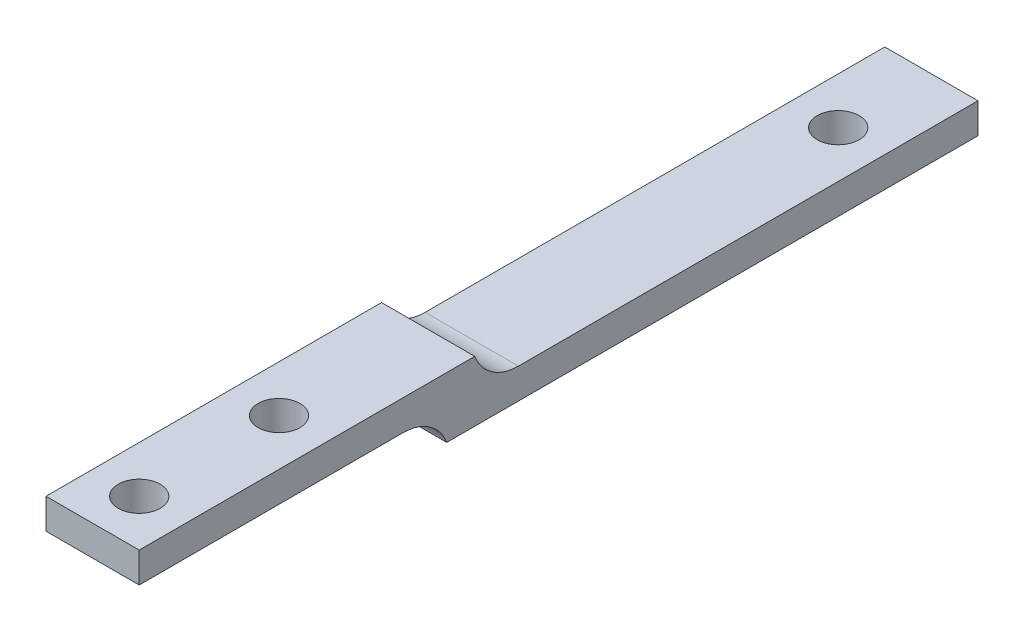
ISO-10303-21;
HEADER;
FILE_DESCRIPTION(('STEP AP214'),'2;1');
FILE_NAME('part.step','',(''),(''),'','','');
FILE_SCHEMA(('AUTOMOTIVE_DESIGN { 1 0 10303 214 1 1 1 1 }'));
ENDSEC;
DATA;
#1=APPLICATION_CONTEXT('core data for automotive mechanical design processes');
#2=APPLICATION_PROTOCOL_DEFINITION('international standard','automotive_design',2000,#1);
#3=PRODUCT_CONTEXT('',#1,'mechanical');
#4=PRODUCT('Part','Part','',(#3));
#5=PRODUCT_RELATED_PRODUCT_CATEGORY('part','',(#4));
#6=PRODUCT_DEFINITION_FORMATION('','',#4);
#7=PRODUCT_DEFINITION_CONTEXT('part definition',#1,'design');
#8=PRODUCT_DEFINITION('design','',#6,#7);
#9=PRODUCT_DEFINITION_SHAPE('','',#8);
#10=(LENGTH_UNIT() NAMED_UNIT(*) SI_UNIT(.MILLI.,.METRE.));
#11=(NAMED_UNIT(*) PLANE_ANGLE_UNIT() SI_UNIT($,.RADIAN.));
#12=(NAMED_UNIT(*) SI_UNIT($,.STERADIAN.) SOLID_ANGLE_UNIT());
#13=UNCERTAINTY_MEASURE_WITH_UNIT(LENGTH_MEASURE(1.E-05),#10,'distance_accuracy_value','');
#14=(GEOMETRIC_REPRESENTATION_CONTEXT(3) GLOBAL_UNCERTAINTY_ASSIGNED_CONTEXT((#13)) GLOBAL_UNIT_ASSIGNED_CONTEXT((#10,
#11,#12)) REPRESENTATION_CONTEXT('',''));
#15=CARTESIAN_POINT('',(0.,0.,0.));
#16=DIRECTION('',(0.,0.,1.));
#17=DIRECTION('',(1.,0.,0.));
#18=AXIS2_PLACEMENT_3D('',#15,#16,#17);
#19=CARTESIAN_POINT('',(0.,6.5,0.));
#20=DIRECTION('',(0.,-1.,0.));
#21=DIRECTION('',(0.,0.,-1.));
#22=AXIS2_PLACEMENT_3D('',#19,#20,#21);
#23=PLANE('',#22);
#24=CARTESIAN_POINT('',(0.,6.5,-5.));
#25=DIRECTION('',(0.,1.,0.));
#26=DIRECTION('',(0.,0.,1.));
#27=AXIS2_PLACEMENT_3D('',#24,#25,#26);
#28=CIRCLE('',#27,2.25);
#29=CARTESIAN_POINT('',(0.,6.5,-7.25));
#30=VERTEX_POINT('',#29);
#31=EDGE_CURVE('E177',#30,#30,#28,.T.);
#32=ORIENTED_EDGE('',*,*,#31,.F.);
#33=EDGE_LOOP('',(#32));
#34=FACE_BOUND('',#33,.T.);
#35=CARTESIAN_POINT('',(0.,6.5,-20.));
#36=DIRECTION('',(0.,1.,0.));
#37=DIRECTION('',(0.,0.,1.));
#38=AXIS2_PLACEMENT_3D('',#35,#36,#37);
#39=CIRCLE('',#38,2.25);
#40=CARTESIAN_POINT('',(0.,6.5,-22.25));
#41=VERTEX_POINT('',#40);
#42=EDGE_CURVE('E180',#41,#41,#39,.T.);
#43=ORIENTED_EDGE('',*,*,#42,.F.);
#44=EDGE_LOOP('',(#43));
#45=FACE_BOUND('',#44,.T.);
#46=DIRECTION('',(-1.,0.,0.));
#47=VECTOR('',#46,1.);
#48=CARTESIAN_POINT('',(5.,6.5,-36.));
#49=LINE('',#48,#47);
#50=CARTESIAN_POINT('',(5.,6.5,-36.));
#51=VERTEX_POINT('',#50);
#52=CARTESIAN_POINT('',(-5.,6.5,-36.));
#53=VERTEX_POINT('',#52);
#54=EDGE_CURVE('E167',#51,#53,#49,.T.);
#55=ORIENTED_EDGE('',*,*,#54,.T.);
#56=DIRECTION('',(0.,0.,1.));
#57=VECTOR('',#56,1.);
#58=CARTESIAN_POINT('',(-5.,6.5,0.));
#59=LINE('',#58,#57);
#60=CARTESIAN_POINT('',(-5.,6.5,0.));
#61=VERTEX_POINT('',#60);
#62=EDGE_CURVE('E132',#53,#61,#59,.T.);
#63=ORIENTED_EDGE('',*,*,#62,.T.);
#64=DIRECTION('',(1.,0.,0.));
#65=VECTOR('',#64,1.);
#66=CARTESIAN_POINT('',(5.,6.5,0.));
#67=LINE('',#66,#65);
#68=CARTESIAN_POINT('',(5.,6.5,0.));
#69=VERTEX_POINT('',#68);
#70=EDGE_CURVE('E120',#61,#69,#67,.T.);
#71=ORIENTED_EDGE('',*,*,#70,.T.);
#72=DIRECTION('',(0.,0.,-1.));
#73=VECTOR('',#72,1.);
#74=CARTESIAN_POINT('',(5.,6.5,-90.));
#75=LINE('',#74,#73);
#76=EDGE_CURVE('E124',#69,#51,#75,.T.);
#77=ORIENTED_EDGE('',*,*,#76,.T.);
#78=EDGE_LOOP('',(#55,#63,#71,#77));
#79=FACE_BOUND('',#78,.T.);
#80=ADVANCED_FACE('F33',(#34,#45,#79),#23,.F.);
#81=CARTESIAN_POINT('',(0.,0.,0.));
#82=DIRECTION('',(0.,-1.,0.));
#83=DIRECTION('',(0.,0.,-1.));
#84=AXIS2_PLACEMENT_3D('',#81,#82,#83);
#85=PLANE('',#84);
#86=CARTESIAN_POINT('',(0.,0.,-80.));
#87=DIRECTION('',(0.,1.,0.));
#88=DIRECTION('',(0.,0.,1.));
#89=AXIS2_PLACEMENT_3D('',#86,#87,#88);
#90=CIRCLE('',#89,2.25);
#91=CARTESIAN_POINT('',(0.,0.,-82.25));
#92=VERTEX_POINT('',#91);
#93=EDGE_CURVE('E174',#92,#92,#90,.T.);
#94=ORIENTED_EDGE('',*,*,#93,.T.);
#95=EDGE_LOOP('',(#94));
#96=FACE_BOUND('',#95,.T.);
#97=DIRECTION('',(0.,0.,-1.));
#98=VECTOR('',#97,1.);
#99=CARTESIAN_POINT('',(5.,0.,-90.));
#100=LINE('',#99,#98);
#101=CARTESIAN_POINT('',(5.,0.,-33.));
#102=VERTEX_POINT('',#101);
#103=CARTESIAN_POINT('',(5.,0.,-90.));
#104=VERTEX_POINT('',#103);
#105=EDGE_CURVE('E112',#102,#104,#100,.T.);
#106=ORIENTED_EDGE('',*,*,#105,.F.);
#107=DIRECTION('',(-1.,0.,0.));
#108=VECTOR('',#107,1.);
#109=CARTESIAN_POINT('',(5.,0.,-33.));
#110=LINE('',#109,#108);
#111=CARTESIAN_POINT('',(-5.,0.,-33.));
#112=VERTEX_POINT('',#111);
#113=EDGE_CURVE('E100',#102,#112,#110,.T.);
#114=ORIENTED_EDGE('',*,*,#113,.T.);
#115=DIRECTION('',(0.,0.,1.));
#116=VECTOR('',#115,1.);
#117=CARTESIAN_POINT('',(-5.,0.,0.));
#118=LINE('',#117,#116);
#119=CARTESIAN_POINT('',(-5.,0.,-90.));
#120=VERTEX_POINT('',#119);
#121=EDGE_CURVE('E111',#120,#112,#118,.T.);
#122=ORIENTED_EDGE('',*,*,#121,.F.);
#123=DIRECTION('',(-1.,0.,0.));
#124=VECTOR('',#123,1.);
#125=CARTESIAN_POINT('',(-5.,0.,-90.));
#126=LINE('',#125,#124);
#127=EDGE_CURVE('E121',#104,#120,#126,.T.);
#128=ORIENTED_EDGE('',*,*,#127,.F.);
#129=EDGE_LOOP('',(#106,#114,#122,#128));
#130=FACE_BOUND('',#129,.T.);
#131=ADVANCED_FACE('F109',(#96,#130),#85,.T.);
#132=CARTESIAN_POINT('',(5.,6.5,-90.));
#133=DIRECTION('',(-1.,0.,0.));
#134=DIRECTION('',(0.,0.,1.));
#135=AXIS2_PLACEMENT_3D('',#132,#133,#134);
#136=PLANE('',#135);
#137=DIRECTION('',(0.,0.,1.));
#138=VECTOR('',#137,1.);
#139=CARTESIAN_POINT('',(5.,3.25,0.));
#140=LINE('',#139,#138);
#141=CARTESIAN_POINT('',(5.,3.25,-28.3162515012012));
#142=VERTEX_POINT('',#141);
#143=CARTESIAN_POINT('',(5.,3.25,0.));
#144=VERTEX_POINT('',#143);
#145=EDGE_CURVE('E152',#142,#144,#140,.T.);
#146=ORIENTED_EDGE('',*,*,#145,.F.);
#147=CARTESIAN_POINT('',(5.,-1.75,-28.3162515012012));
#148=DIRECTION('',(-1.,0.,0.));
#149=DIRECTION('',(0.,0.,1.));
#150=AXIS2_PLACEMENT_3D('',#147,#148,#149);
#151=CIRCLE('',#150,5.);
#152=EDGE_CURVE('E104',#142,#102,#151,.T.);
#153=ORIENTED_EDGE('',*,*,#152,.T.);
#154=ORIENTED_EDGE('',*,*,#105,.T.);
#155=DIRECTION('',(0.,-1.,0.));
#156=VECTOR('',#155,1.);
#157=CARTESIAN_POINT('',(5.,6.5,-90.));
#158=LINE('',#157,#156);
#159=CARTESIAN_POINT('',(5.,3.25,-90.));
#160=VERTEX_POINT('',#159);
#161=EDGE_CURVE('E134',#160,#104,#158,.T.);
#162=ORIENTED_EDGE('',*,*,#161,.F.);
#163=DIRECTION('',(0.,0.,-1.));
#164=VECTOR('',#163,1.);
#165=CARTESIAN_POINT('',(5.,3.25,-90.));
#166=LINE('',#165,#164);
#167=CARTESIAN_POINT('',(5.,3.25,-40.6837484987988));
#168=VERTEX_POINT('',#167);
#169=EDGE_CURVE('E165',#168,#160,#166,.T.);
#170=ORIENTED_EDGE('',*,*,#169,.F.);
#171=CARTESIAN_POINT('',(5.,8.25,-40.6837484987988));
#172=DIRECTION('',(-1.,0.,0.));
#173=DIRECTION('',(0.,0.,1.));
#174=AXIS2_PLACEMENT_3D('',#171,#172,#173);
#175=CIRCLE('',#174,5.);
#176=EDGE_CURVE('E11',#168,#51,#175,.T.);
#177=ORIENTED_EDGE('',*,*,#176,.T.);
#178=ORIENTED_EDGE('',*,*,#76,.F.);
#179=DIRECTION('',(0.,-1.,0.));
#180=VECTOR('',#179,1.);
#181=CARTESIAN_POINT('',(5.,6.5,0.));
#182=LINE('',#181,#180);
#183=EDGE_CURVE('E137',#69,#144,#182,.T.);
#184=ORIENTED_EDGE('',*,*,#183,.T.);
#185=EDGE_LOOP('',(#146,#153,#154,#162,#170,#177,#178,#184));
#186=FACE_BOUND('',#185,.T.);
#187=ADVANCED_FACE('F150',(#186),#136,.F.);
#188=CARTESIAN_POINT('',(-5.,6.5,-90.));
#189=DIRECTION('',(0.,0.,1.));
#190=DIRECTION('',(1.,0.,0.));
#191=AXIS2_PLACEMENT_3D('',#188,#189,#190);
#192=PLANE('',#191);
#193=DIRECTION('',(-1.,0.,0.));
#194=VECTOR('',#193,1.);
#195=CARTESIAN_POINT('',(5.,3.25,-90.));
#196=LINE('',#195,#194);
#197=CARTESIAN_POINT('',(-5.,3.25,-90.));
#198=VERTEX_POINT('',#197);
#199=EDGE_CURVE('E160',#160,#198,#196,.T.);
#200=ORIENTED_EDGE('',*,*,#199,.F.);
#201=ORIENTED_EDGE('',*,*,#161,.T.);
#202=ORIENTED_EDGE('',*,*,#127,.T.);
#203=DIRECTION('',(0.,-1.,0.));
#204=VECTOR('',#203,1.);
#205=CARTESIAN_POINT('',(-5.,6.5,-90.));
#206=LINE('',#205,#204);
#207=EDGE_CURVE('E118',#198,#120,#206,.T.);
#208=ORIENTED_EDGE('',*,*,#207,.F.);
#209=EDGE_LOOP('',(#200,#201,#202,#208));
#210=FACE_BOUND('',#209,.T.);
#211=ADVANCED_FACE('F223',(#210),#192,.F.);
#212=CARTESIAN_POINT('',(-5.,6.5,0.));
#213=DIRECTION('',(1.,0.,0.));
#214=DIRECTION('',(0.,0.,-1.));
#215=AXIS2_PLACEMENT_3D('',#212,#213,#214);
#216=PLANE('',#215);
#217=ORIENTED_EDGE('',*,*,#121,.T.);
#218=CARTESIAN_POINT('',(-5.,-1.75,-28.3162515012012));
#219=DIRECTION('',(1.,0.,0.));
#220=DIRECTION('',(0.,0.,-1.));
#221=AXIS2_PLACEMENT_3D('',#218,#219,#220);
#222=CIRCLE('',#221,5.);
#223=CARTESIAN_POINT('',(-5.,3.25,-28.3162515012012));
#224=VERTEX_POINT('',#223);
#225=EDGE_CURVE('E96',#112,#224,#222,.T.);
#226=ORIENTED_EDGE('',*,*,#225,.T.);
#227=DIRECTION('',(0.,0.,1.));
#228=VECTOR('',#227,1.);
#229=CARTESIAN_POINT('',(-5.,3.25,0.));
#230=LINE('',#229,#228);
#231=CARTESIAN_POINT('',(-5.,3.25,0.));
#232=VERTEX_POINT('',#231);
#233=EDGE_CURVE('E157',#224,#232,#230,.T.);
#234=ORIENTED_EDGE('',*,*,#233,.T.);
#235=DIRECTION('',(0.,-1.,0.));
#236=VECTOR('',#235,1.);
#237=CARTESIAN_POINT('',(-5.,6.5,0.));
#238=LINE('',#237,#236);
#239=EDGE_CURVE('E129',#61,#232,#238,.T.);
#240=ORIENTED_EDGE('',*,*,#239,.F.);
#241=ORIENTED_EDGE('',*,*,#62,.F.);
#242=CARTESIAN_POINT('',(-5.,8.25,-40.6837484987988));
#243=DIRECTION('',(1.,0.,0.));
#244=DIRECTION('',(0.,0.,-1.));
#245=AXIS2_PLACEMENT_3D('',#242,#243,#244);
#246=CIRCLE('',#245,5.);
#247=CARTESIAN_POINT('',(-5.,3.25,-40.6837484987988));
#248=VERTEX_POINT('',#247);
#249=EDGE_CURVE('E41',#53,#248,#246,.T.);
#250=ORIENTED_EDGE('',*,*,#249,.T.);
#251=DIRECTION('',(0.,0.,-1.));
#252=VECTOR('',#251,1.);
#253=CARTESIAN_POINT('',(-5.,3.25,-90.));
#254=LINE('',#253,#252);
#255=EDGE_CURVE('E163',#248,#198,#254,.T.);
#256=ORIENTED_EDGE('',*,*,#255,.T.);
#257=ORIENTED_EDGE('',*,*,#207,.T.);
#258=EDGE_LOOP('',(#217,#226,#234,#240,#241,#250,#256,#257));
#259=FACE_BOUND('',#258,.T.);
#260=ADVANCED_FACE('F116',(#259),#216,.F.);
#261=CARTESIAN_POINT('',(0.,6.5,0.));
#262=DIRECTION('',(0.,0.,-1.));
#263=DIRECTION('',(-1.,0.,0.));
#264=AXIS2_PLACEMENT_3D('',#261,#262,#263);
#265=PLANE('',#264);
#266=DIRECTION('',(-1.,0.,0.));
#267=VECTOR('',#266,1.);
#268=CARTESIAN_POINT('',(5.,3.25,0.));
#269=LINE('',#268,#267);
#270=EDGE_CURVE('E114',#144,#232,#269,.T.);
#271=ORIENTED_EDGE('',*,*,#270,.F.);
#272=ORIENTED_EDGE('',*,*,#183,.F.);
#273=ORIENTED_EDGE('',*,*,#70,.F.);
#274=ORIENTED_EDGE('',*,*,#239,.T.);
#275=EDGE_LOOP('',(#271,#272,#273,#274));
#276=FACE_BOUND('',#275,.T.);
#277=ADVANCED_FACE('F190',(#276),#265,.F.);
#278=CARTESIAN_POINT('',(0.,6.5,-20.));
#279=DIRECTION('',(0.,-1.,0.));
#280=DIRECTION('',(0.,0.,-1.));
#281=AXIS2_PLACEMENT_3D('',#278,#279,#280);
#282=CYLINDRICAL_SURFACE('',#281,2.25);
#283=CARTESIAN_POINT('',(0.,3.25,-20.));
#284=DIRECTION('',(0.,-1.,0.));
#285=DIRECTION('',(0.,0.,-1.));
#286=AXIS2_PLACEMENT_3D('',#283,#284,#285);
#287=CIRCLE('',#286,2.25);
#288=CARTESIAN_POINT('',(0.,3.25,-22.25));
#289=VERTEX_POINT('',#288);
#290=EDGE_CURVE('E145',#289,#289,#287,.T.);
#291=CARTESIAN_POINT('',(0.,6.5,-22.25));
#292=CARTESIAN_POINT('',(0.,6.46614583333333,-22.25));
#293=CARTESIAN_POINT('',(0.,6.43229166666667,-22.25));
#294=CARTESIAN_POINT('',(0.,6.36458333333333,-22.25));
#295=CARTESIAN_POINT('',(0.,6.33072916666667,-22.25));
#296=CARTESIAN_POINT('',(0.,6.26302083333333,-22.25));
#297=CARTESIAN_POINT('',(0.,6.22916666666667,-22.25));
#298=CARTESIAN_POINT('',(0.,6.16145833333333,-22.25));
#299=CARTESIAN_POINT('',(0.,6.12760416666667,-22.25));
#300=CARTESIAN_POINT('',(0.,6.05989583333333,-22.25));
#301=CARTESIAN_POINT('',(0.,6.02604166666667,-22.25));
#302=CARTESIAN_POINT('',(0.,5.95833333333333,-22.25));
#303=CARTESIAN_POINT('',(0.,5.92447916666667,-22.25));
#304=CARTESIAN_POINT('',(0.,5.85677083333333,-22.25));
#305=CARTESIAN_POINT('',(0.,5.82291666666667,-22.25));
#306=CARTESIAN_POINT('',(0.,5.75520833333333,-22.25));
#307=CARTESIAN_POINT('',(0.,5.72135416666667,-22.25));
#308=CARTESIAN_POINT('',(0.,5.65364583333333,-22.25));
#309=CARTESIAN_POINT('',(0.,5.61979166666667,-22.25));
#310=CARTESIAN_POINT('',(0.,5.55208333333333,-22.25));
#311=CARTESIAN_POINT('',(0.,5.51822916666667,-22.25));
#312=CARTESIAN_POINT('',(0.,5.45052083333333,-22.25));
#313=CARTESIAN_POINT('',(0.,5.41666666666667,-22.25));
#314=CARTESIAN_POINT('',(0.,5.34895833333333,-22.25));
#315=CARTESIAN_POINT('',(0.,5.31510416666667,-22.25));
#316=CARTESIAN_POINT('',(0.,5.24739583333333,-22.25));
#317=CARTESIAN_POINT('',(0.,5.21354166666667,-22.25));
#318=CARTESIAN_POINT('',(0.,5.14583333333333,-22.25));
#319=CARTESIAN_POINT('',(0.,5.11197916666667,-22.25));
#320=CARTESIAN_POINT('',(0.,5.04427083333333,-22.25));
#321=CARTESIAN_POINT('',(0.,5.01041666666667,-22.25));
#322=CARTESIAN_POINT('',(0.,4.94270833333333,-22.25));
#323=CARTESIAN_POINT('',(0.,4.90885416666667,-22.25));
#324=CARTESIAN_POINT('',(0.,4.84114583333333,-22.25));
#325=CARTESIAN_POINT('',(0.,4.80729166666667,-22.25));
#326=CARTESIAN_POINT('',(0.,4.73958333333333,-22.25));
#327=CARTESIAN_POINT('',(0.,4.70572916666667,-22.25));
#328=CARTESIAN_POINT('',(0.,4.63802083333333,-22.25));
#329=CARTESIAN_POINT('',(0.,4.60416666666667,-22.25));
#330=CARTESIAN_POINT('',(0.,4.53645833333333,-22.25));
#331=CARTESIAN_POINT('',(0.,4.50260416666667,-22.25));
#332=CARTESIAN_POINT('',(0.,4.43489583333333,-22.25));
#333=CARTESIAN_POINT('',(0.,4.40104166666667,-22.25));
#334=CARTESIAN_POINT('',(0.,4.33333333333333,-22.25));
#335=CARTESIAN_POINT('',(0.,4.29947916666667,-22.25));
#336=CARTESIAN_POINT('',(0.,4.23177083333333,-22.25));
#337=CARTESIAN_POINT('',(0.,4.19791666666667,-22.25));
#338=CARTESIAN_POINT('',(0.,4.13020833333333,-22.25));
#339=CARTESIAN_POINT('',(0.,4.09635416666667,-22.25));
#340=CARTESIAN_POINT('',(0.,4.02864583333333,-22.25));
#341=CARTESIAN_POINT('',(0.,3.99479166666667,-22.25));
#342=CARTESIAN_POINT('',(0.,3.92708333333333,-22.25));
#343=CARTESIAN_POINT('',(0.,3.89322916666667,-22.25));
#344=CARTESIAN_POINT('',(0.,3.82552083333333,-22.25));
#345=CARTESIAN_POINT('',(0.,3.79166666666667,-22.25));
#346=CARTESIAN_POINT('',(0.,3.72395833333333,-22.25));
#347=CARTESIAN_POINT('',(0.,3.69010416666667,-22.25));
#348=CARTESIAN_POINT('',(0.,3.62239583333333,-22.25));
#349=CARTESIAN_POINT('',(0.,3.58854166666667,-22.25));
#350=CARTESIAN_POINT('',(0.,3.52083333333333,-22.25));
#351=CARTESIAN_POINT('',(0.,3.48697916666667,-22.25));
#352=CARTESIAN_POINT('',(0.,3.41927083333333,-22.25));
#353=CARTESIAN_POINT('',(0.,3.38541666666667,-22.25));
#354=CARTESIAN_POINT('',(0.,3.31770833333333,-22.25));
#355=CARTESIAN_POINT('',(0.,3.28385416666667,-22.25));
#356=CARTESIAN_POINT('',(0.,3.25,-22.25));
#357=B_SPLINE_CURVE_WITH_KNOTS('',3,(#291,#292,#293,#294,#295,#296,#297,#298,#299,#300,#301,
#302,#303,#304,#305,#306,#307,#308,#309,#310,#311,#312,#313,#314,#315,#316,#317,#318,#319,#320,
#321,#322,#323,#324,#325,#326,#327,#328,#329,#330,#331,#332,#333,#334,#335,#336,#337,#338,#339,
#340,#341,#342,#343,#344,#345,#346,#347,#348,#349,#350,#351,#352,#353,#354,#355,#356),
.UNSPECIFIED.,.F.,.F.,(4,2,2,2,2,2,2,2,2,2,2,2,2,2,2,2,2,2,2,2,2,2,2,2,2,2,2,2,2,2,2,2,4),(0.,
0.101562499999999,0.203124999999999,0.304687499999999,0.40625,0.5078125,0.609375,0.7109375,
0.812499999999999,0.914062499999999,1.015625,1.1171875,1.21875,1.3203125,1.421875,1.5234375,
1.625,1.7265625,1.828125,1.9296875,2.03125,2.1328125,2.234375,2.3359375,2.4375,2.5390625,
2.640625,2.7421875,2.84375,2.9453125,3.046875,3.1484375,3.25),.UNSPECIFIED.);
#358=EDGE_CURVE('BSEAM216',#41,#289,#357,.T.);
#359=ORIENTED_EDGE('',*,*,#42,.T.);
#360=ORIENTED_EDGE('',*,*,#290,.T.);
#361=ORIENTED_EDGE('',*,*,#358,.T.);
#362=ORIENTED_EDGE('',*,*,#358,.F.);
#363=EDGE_LOOP('',(#359,#361,#360,#362));
#364=FACE_BOUND('',#363,.T.);
#365=ADVANCED_FACE('F216',(#364),#282,.F.);
#366=CARTESIAN_POINT('',(0.,6.5,-5.));
#367=DIRECTION('',(0.,-1.,0.));
#368=DIRECTION('',(0.,0.,-1.));
#369=AXIS2_PLACEMENT_3D('',#366,#367,#368);
#370=CYLINDRICAL_SURFACE('',#369,2.25);
#371=CARTESIAN_POINT('',(0.,3.25,-5.));
#372=DIRECTION('',(0.,-1.,0.));
#373=DIRECTION('',(0.,0.,-1.));
#374=AXIS2_PLACEMENT_3D('',#371,#372,#373);
#375=CIRCLE('',#374,2.25);
#376=CARTESIAN_POINT('',(0.,3.25,-7.25));
#377=VERTEX_POINT('',#376);
#378=EDGE_CURVE('E142',#377,#377,#375,.T.);
#379=CARTESIAN_POINT('',(0.,6.5,-7.25));
#380=CARTESIAN_POINT('',(0.,6.46614583333333,-7.25));
#381=CARTESIAN_POINT('',(0.,6.43229166666667,-7.25));
#382=CARTESIAN_POINT('',(0.,6.36458333333333,-7.25));
#383=CARTESIAN_POINT('',(0.,6.33072916666667,-7.25));
#384=CARTESIAN_POINT('',(0.,6.26302083333333,-7.25));
#385=CARTESIAN_POINT('',(0.,6.22916666666667,-7.25));
#386=CARTESIAN_POINT('',(0.,6.16145833333333,-7.25));
#387=CARTESIAN_POINT('',(0.,6.12760416666667,-7.25));
#388=CARTESIAN_POINT('',(0.,6.05989583333333,-7.25));
#389=CARTESIAN_POINT('',(0.,6.02604166666667,-7.25));
#390=CARTESIAN_POINT('',(0.,5.95833333333333,-7.25));
#391=CARTESIAN_POINT('',(0.,5.92447916666667,-7.25));
#392=CARTESIAN_POINT('',(0.,5.85677083333333,-7.25));
#393=CARTESIAN_POINT('',(0.,5.82291666666667,-7.25));
#394=CARTESIAN_POINT('',(0.,5.75520833333333,-7.25));
#395=CARTESIAN_POINT('',(0.,5.72135416666667,-7.25));
#396=CARTESIAN_POINT('',(0.,5.65364583333333,-7.25));
#397=CARTESIAN_POINT('',(0.,5.61979166666667,-7.25));
#398=CARTESIAN_POINT('',(0.,5.55208333333333,-7.25));
#399=CARTESIAN_POINT('',(0.,5.51822916666667,-7.25));
#400=CARTESIAN_POINT('',(0.,5.45052083333333,-7.25));
#401=CARTESIAN_POINT('',(0.,5.41666666666667,-7.25));
#402=CARTESIAN_POINT('',(0.,5.34895833333333,-7.25));
#403=CARTESIAN_POINT('',(0.,5.31510416666667,-7.25));
#404=CARTESIAN_POINT('',(0.,5.24739583333333,-7.25));
#405=CARTESIAN_POINT('',(0.,5.21354166666667,-7.25));
#406=CARTESIAN_POINT('',(0.,5.14583333333333,-7.25));
#407=CARTESIAN_POINT('',(0.,5.11197916666667,-7.25));
#408=CARTESIAN_POINT('',(0.,5.04427083333333,-7.25));
#409=CARTESIAN_POINT('',(0.,5.01041666666667,-7.25));
#410=CARTESIAN_POINT('',(0.,4.94270833333333,-7.25));
#411=CARTESIAN_POINT('',(0.,4.90885416666667,-7.25));
#412=CARTESIAN_POINT('',(0.,4.84114583333333,-7.25));
#413=CARTESIAN_POINT('',(0.,4.80729166666667,-7.25));
#414=CARTESIAN_POINT('',(0.,4.73958333333333,-7.25));
#415=CARTESIAN_POINT('',(0.,4.70572916666667,-7.25));
#416=CARTESIAN_POINT('',(0.,4.63802083333333,-7.25));
#417=CARTESIAN_POINT('',(0.,4.60416666666667,-7.25));
#418=CARTESIAN_POINT('',(0.,4.53645833333333,-7.25));
#419=CARTESIAN_POINT('',(0.,4.50260416666667,-7.25));
#420=CARTESIAN_POINT('',(0.,4.43489583333333,-7.25));
#421=CARTESIAN_POINT('',(0.,4.40104166666667,-7.25));
#422=CARTESIAN_POINT('',(0.,4.33333333333333,-7.25));
#423=CARTESIAN_POINT('',(0.,4.29947916666667,-7.25));
#424=CARTESIAN_POINT('',(0.,4.23177083333333,-7.25));
#425=CARTESIAN_POINT('',(0.,4.19791666666667,-7.25));
#426=CARTESIAN_POINT('',(0.,4.13020833333333,-7.25));
#427=CARTESIAN_POINT('',(0.,4.09635416666667,-7.25));
#428=CARTESIAN_POINT('',(0.,4.02864583333333,-7.25));
#429=CARTESIAN_POINT('',(0.,3.99479166666667,-7.25));
#430=CARTESIAN_POINT('',(0.,3.92708333333333,-7.25));
#431=CARTESIAN_POINT('',(0.,3.89322916666667,-7.25));
#432=CARTESIAN_POINT('',(0.,3.82552083333333,-7.25));
#433=CARTESIAN_POINT('',(0.,3.79166666666667,-7.25));
#434=CARTESIAN_POINT('',(0.,3.72395833333333,-7.25));
#435=CARTESIAN_POINT('',(0.,3.69010416666667,-7.25));
#436=CARTESIAN_POINT('',(0.,3.62239583333333,-7.25));
#437=CARTESIAN_POINT('',(0.,3.58854166666667,-7.25));
#438=CARTESIAN_POINT('',(0.,3.52083333333333,-7.25));
#439=CARTESIAN_POINT('',(0.,3.48697916666667,-7.25));
#440=CARTESIAN_POINT('',(0.,3.41927083333333,-7.25));
#441=CARTESIAN_POINT('',(0.,3.38541666666667,-7.25));
#442=CARTESIAN_POINT('',(0.,3.31770833333333,-7.25));
#443=CARTESIAN_POINT('',(0.,3.28385416666667,-7.25));
#444=CARTESIAN_POINT('',(0.,3.25,-7.25));
#445=B_SPLINE_CURVE_WITH_KNOTS('',3,(#379,#380,#381,#382,#383,#384,#385,#386,#387,#388,#389,
#390,#391,#392,#393,#394,#395,#396,#397,#398,#399,#400,#401,#402,#403,#404,#405,#406,#407,#408,
#409,#410,#411,#412,#413,#414,#415,#416,#417,#418,#419,#420,#421,#422,#423,#424,#425,#426,#427,
#428,#429,#430,#431,#432,#433,#434,#435,#436,#437,#438,#439,#440,#441,#442,#443,#444),
.UNSPECIFIED.,.F.,.F.,(4,2,2,2,2,2,2,2,2,2,2,2,2,2,2,2,2,2,2,2,2,2,2,2,2,2,2,2,2,2,2,2,4),(0.,
0.1015625,0.203125,0.3046875,0.40625,0.5078125,0.609375,0.7109375,0.8125,0.9140625,1.015625,
1.1171875,1.21875,1.3203125,1.421875,1.5234375,1.625,1.7265625,1.828125,1.9296875,2.03125,
2.1328125,2.234375,2.3359375,2.4375,2.5390625,2.640625,2.7421875,2.84375,2.9453125,3.046875,
3.1484375,3.25),.UNSPECIFIED.);
#446=EDGE_CURVE('BSEAM251',#30,#377,#445,.T.);
#447=ORIENTED_EDGE('',*,*,#31,.T.);
#448=ORIENTED_EDGE('',*,*,#378,.T.);
#449=ORIENTED_EDGE('',*,*,#446,.T.);
#450=ORIENTED_EDGE('',*,*,#446,.F.);
#451=EDGE_LOOP('',(#447,#449,#448,#450));
#452=FACE_BOUND('',#451,.T.);
#453=ADVANCED_FACE('F251',(#452),#370,.F.);
#454=CARTESIAN_POINT('',(0.,6.5,-80.));
#455=DIRECTION('',(0.,-1.,0.));
#456=DIRECTION('',(0.,0.,-1.));
#457=AXIS2_PLACEMENT_3D('',#454,#455,#456);
#458=CYLINDRICAL_SURFACE('',#457,2.25);
#459=CARTESIAN_POINT('',(0.,3.25,-80.));
#460=DIRECTION('',(0.,1.,0.));
#461=DIRECTION('',(0.,0.,1.));
#462=AXIS2_PLACEMENT_3D('',#459,#460,#461);
#463=CIRCLE('',#462,2.25);
#464=CARTESIAN_POINT('',(0.,3.25,-82.25));
#465=VERTEX_POINT('',#464);
#466=EDGE_CURVE('E113',#465,#465,#463,.T.);
#467=CARTESIAN_POINT('',(0.,0.,-82.25));
#468=CARTESIAN_POINT('',(0.,0.0338541666666667,-82.25));
#469=CARTESIAN_POINT('',(0.,0.0677083333333334,-82.25));
#470=CARTESIAN_POINT('',(0.,0.135416666666667,-82.25));
#471=CARTESIAN_POINT('',(0.,0.169270833333334,-82.25));
#472=CARTESIAN_POINT('',(0.,0.236979166666667,-82.25));
#473=CARTESIAN_POINT('',(0.,0.270833333333333,-82.25));
#474=CARTESIAN_POINT('',(0.,0.338541666666666,-82.25));
#475=CARTESIAN_POINT('',(0.,0.372395833333333,-82.25));
#476=CARTESIAN_POINT('',(0.,0.440104166666666,-82.25));
#477=CARTESIAN_POINT('',(0.,0.473958333333333,-82.25));
#478=CARTESIAN_POINT('',(0.,0.541666666666666,-82.25));
#479=CARTESIAN_POINT('',(0.,0.575520833333333,-82.25));
#480=CARTESIAN_POINT('',(0.,0.643229166666666,-82.25));
#481=CARTESIAN_POINT('',(0.,0.677083333333333,-82.25));
#482=CARTESIAN_POINT('',(0.,0.744791666666667,-82.25));
#483=CARTESIAN_POINT('',(0.,0.778645833333333,-82.25));
#484=CARTESIAN_POINT('',(0.,0.846354166666667,-82.25));
#485=CARTESIAN_POINT('',(0.,0.880208333333333,-82.25));
#486=CARTESIAN_POINT('',(0.,0.947916666666666,-82.25));
#487=CARTESIAN_POINT('',(0.,0.981770833333333,-82.25));
#488=CARTESIAN_POINT('',(0.,1.04947916666667,-82.25));
#489=CARTESIAN_POINT('',(0.,1.08333333333333,-82.25));
#490=CARTESIAN_POINT('',(0.,1.15104166666667,-82.25));
#491=CARTESIAN_POINT('',(0.,1.18489583333333,-82.25));
#492=CARTESIAN_POINT('',(0.,1.25260416666667,-82.25));
#493=CARTESIAN_POINT('',(0.,1.28645833333333,-82.25));
#494=CARTESIAN_POINT('',(0.,1.35416666666667,-82.25));
#495=CARTESIAN_POINT('',(0.,1.38802083333333,-82.25));
#496=CARTESIAN_POINT('',(0.,1.45572916666667,-82.25));
#497=CARTESIAN_POINT('',(0.,1.48958333333333,-82.25));
#498=CARTESIAN_POINT('',(0.,1.55729166666667,-82.25));
#499=CARTESIAN_POINT('',(0.,1.59114583333333,-82.25));
#500=CARTESIAN_POINT('',(0.,1.65885416666667,-82.25));
#501=CARTESIAN_POINT('',(0.,1.69270833333333,-82.25));
#502=CARTESIAN_POINT('',(0.,1.76041666666667,-82.25));
#503=CARTESIAN_POINT('',(0.,1.79427083333333,-82.25));
#504=CARTESIAN_POINT('',(0.,1.86197916666667,-82.25));
#505=CARTESIAN_POINT('',(0.,1.89583333333333,-82.25));
#506=CARTESIAN_POINT('',(0.,1.96354166666667,-82.25));
#507=CARTESIAN_POINT('',(0.,1.99739583333333,-82.25));
#508=CARTESIAN_POINT('',(0.,2.06510416666667,-82.25));
#509=CARTESIAN_POINT('',(0.,2.09895833333333,-82.25));
#510=CARTESIAN_POINT('',(0.,2.16666666666667,-82.25));
#511=CARTESIAN_POINT('',(0.,2.20052083333333,-82.25));
#512=CARTESIAN_POINT('',(0.,2.26822916666667,-82.25));
#513=CARTESIAN_POINT('',(0.,2.30208333333333,-82.25));
#514=CARTESIAN_POINT('',(0.,2.36979166666667,-82.25));
#515=CARTESIAN_POINT('',(0.,2.40364583333333,-82.25));
#516=CARTESIAN_POINT('',(0.,2.47135416666667,-82.25));
#517=CARTESIAN_POINT('',(0.,2.50520833333333,-82.25));
#518=CARTESIAN_POINT('',(0.,2.57291666666667,-82.25));
#519=CARTESIAN_POINT('',(0.,2.60677083333333,-82.25));
#520=CARTESIAN_POINT('',(0.,2.67447916666667,-82.25));
#521=CARTESIAN_POINT('',(0.,2.70833333333333,-82.25));
#522=CARTESIAN_POINT('',(0.,2.77604166666666,-82.25));
#523=CARTESIAN_POINT('',(0.,2.80989583333333,-82.25));
#524=CARTESIAN_POINT('',(0.,2.87760416666667,-82.25));
#525=CARTESIAN_POINT('',(0.,2.91145833333333,-82.25));
#526=CARTESIAN_POINT('',(0.,2.97916666666667,-82.25));
#527=CARTESIAN_POINT('',(0.,3.01302083333333,-82.25));
#528=CARTESIAN_POINT('',(0.,3.08072916666666,-82.25));
#529=CARTESIAN_POINT('',(0.,3.11458333333333,-82.25));
#530=CARTESIAN_POINT('',(0.,3.18229166666666,-82.25));
#531=CARTESIAN_POINT('',(0.,3.21614583333333,-82.25));
#532=CARTESIAN_POINT('',(0.,3.25,-82.25));
#533=B_SPLINE_CURVE_WITH_KNOTS('',3,(#467,#468,#469,#470,#471,#472,#473,#474,#475,#476,#477,
#478,#479,#480,#481,#482,#483,#484,#485,#486,#487,#488,#489,#490,#491,#492,#493,#494,#495,#496,
#497,#498,#499,#500,#501,#502,#503,#504,#505,#506,#507,#508,#509,#510,#511,#512,#513,#514,#515,
#516,#517,#518,#519,#520,#521,#522,#523,#524,#525,#526,#527,#528,#529,#530,#531,#532),
.UNSPECIFIED.,.F.,.F.,(4,2,2,2,2,2,2,2,2,2,2,2,2,2,2,2,2,2,2,2,2,2,2,2,2,2,2,2,2,2,2,2,4),(0.,
0.1015625,0.203125,0.304687499999999,0.40625,0.5078125,0.609375,0.7109375,0.8125,0.9140625,
1.015625,1.1171875,1.21875,1.3203125,1.421875,1.5234375,1.625,1.7265625,1.828125,1.9296875,
2.03125,2.1328125,2.234375,2.3359375,2.4375,2.5390625,2.640625,2.7421875,2.84375,2.9453125,
3.046875,3.1484375,3.25),.UNSPECIFIED.);
#534=EDGE_CURVE('BSEAM200',#92,#465,#533,.T.);
#535=ORIENTED_EDGE('',*,*,#93,.F.);
#536=ORIENTED_EDGE('',*,*,#466,.T.);
#537=ORIENTED_EDGE('',*,*,#534,.T.);
#538=ORIENTED_EDGE('',*,*,#534,.F.);
#539=EDGE_LOOP('',(#535,#537,#536,#538));
#540=FACE_BOUND('',#539,.T.);
#541=ADVANCED_FACE('F200',(#540),#458,.F.);
#542=CARTESIAN_POINT('',(5.,3.25,-90.));
#543=DIRECTION('',(0.,1.,0.));
#544=DIRECTION('',(0.,0.,1.));
#545=AXIS2_PLACEMENT_3D('',#542,#543,#544);
#546=PLANE('',#545);
#547=ORIENTED_EDGE('',*,*,#466,.F.);
#548=EDGE_LOOP('',(#547));
#549=FACE_BOUND('',#548,.T.);
#550=ORIENTED_EDGE('',*,*,#255,.F.);
#551=DIRECTION('',(1.,0.,0.));
#552=VECTOR('',#551,1.);
#553=CARTESIAN_POINT('',(5.,3.25,-40.6837484987988));
#554=LINE('',#553,#552);
#555=EDGE_CURVE('E54',#248,#168,#554,.T.);
#556=ORIENTED_EDGE('',*,*,#555,.T.);
#557=ORIENTED_EDGE('',*,*,#169,.T.);
#558=ORIENTED_EDGE('',*,*,#199,.T.);
#559=EDGE_LOOP('',(#550,#556,#557,#558));
#560=FACE_BOUND('',#559,.T.);
#561=ADVANCED_FACE('F193',(#549,#560),#546,.T.);
#562=CARTESIAN_POINT('',(5.,3.25,0.));
#563=DIRECTION('',(0.,-1.,0.));
#564=DIRECTION('',(0.,0.,-1.));
#565=AXIS2_PLACEMENT_3D('',#562,#563,#564);
#566=PLANE('',#565);
#567=ORIENTED_EDGE('',*,*,#290,.F.);
#568=EDGE_LOOP('',(#567));
#569=FACE_BOUND('',#568,.T.);
#570=ORIENTED_EDGE('',*,*,#378,.F.);
#571=EDGE_LOOP('',(#570));
#572=FACE_BOUND('',#571,.T.);
#573=ORIENTED_EDGE('',*,*,#233,.F.);
#574=DIRECTION('',(-1.,0.,0.));
#575=VECTOR('',#574,1.);
#576=CARTESIAN_POINT('',(5.,3.25,-28.3162515012012));
#577=LINE('',#576,#575);
#578=EDGE_CURVE('E101',#224,#142,#577,.F.);
#579=ORIENTED_EDGE('',*,*,#578,.T.);
#580=ORIENTED_EDGE('',*,*,#145,.T.);
#581=ORIENTED_EDGE('',*,*,#270,.T.);
#582=EDGE_LOOP('',(#573,#579,#580,#581));
#583=FACE_BOUND('',#582,.T.);
#584=ADVANCED_FACE('F191',(#569,#572,#583),#566,.T.);
#585=CARTESIAN_POINT('',(5.,-1.75,-28.3162515012012));
#586=DIRECTION('',(1.,0.,0.));
#587=DIRECTION('',(0.,0.,-1.));
#588=AXIS2_PLACEMENT_3D('',#585,#586,#587);
#589=CYLINDRICAL_SURFACE('',#588,5.);
#590=ORIENTED_EDGE('',*,*,#152,.F.);
#591=ORIENTED_EDGE('',*,*,#578,.F.);
#592=ORIENTED_EDGE('',*,*,#225,.F.);
#593=ORIENTED_EDGE('',*,*,#113,.F.);
#594=EDGE_LOOP('',(#590,#591,#592,#593));
#595=FACE_BOUND('',#594,.T.);
#596=ADVANCED_FACE('F99',(#595),#589,.F.);
#597=CARTESIAN_POINT('',(5.,8.25,-40.6837484987988));
#598=DIRECTION('',(-1.,0.,0.));
#599=DIRECTION('',(0.,0.,1.));
#600=AXIS2_PLACEMENT_3D('',#597,#598,#599);
#601=CYLINDRICAL_SURFACE('',#600,5.);
#602=ORIENTED_EDGE('',*,*,#176,.F.);
#603=ORIENTED_EDGE('',*,*,#555,.F.);
#604=ORIENTED_EDGE('',*,*,#249,.F.);
#605=ORIENTED_EDGE('',*,*,#54,.F.);
#606=EDGE_LOOP('',(#602,#603,#604,#605));
#607=FACE_BOUND('',#606,.T.);
#608=ADVANCED_FACE('F35',(#607),#601,.F.);
#609=CLOSED_SHELL('',(#80,#131,#187,#211,#260,#277,#365,#453,#541,#561,#584,#596,#608));
#610=MANIFOLD_SOLID_BREP('B2',#609);
#611=ADVANCED_BREP_SHAPE_REPRESENTATION('',(#18,#610),#14);
#612=SHAPE_DEFINITION_REPRESENTATION(#9,#611);
ENDSEC;
END-ISO-10303-21;
